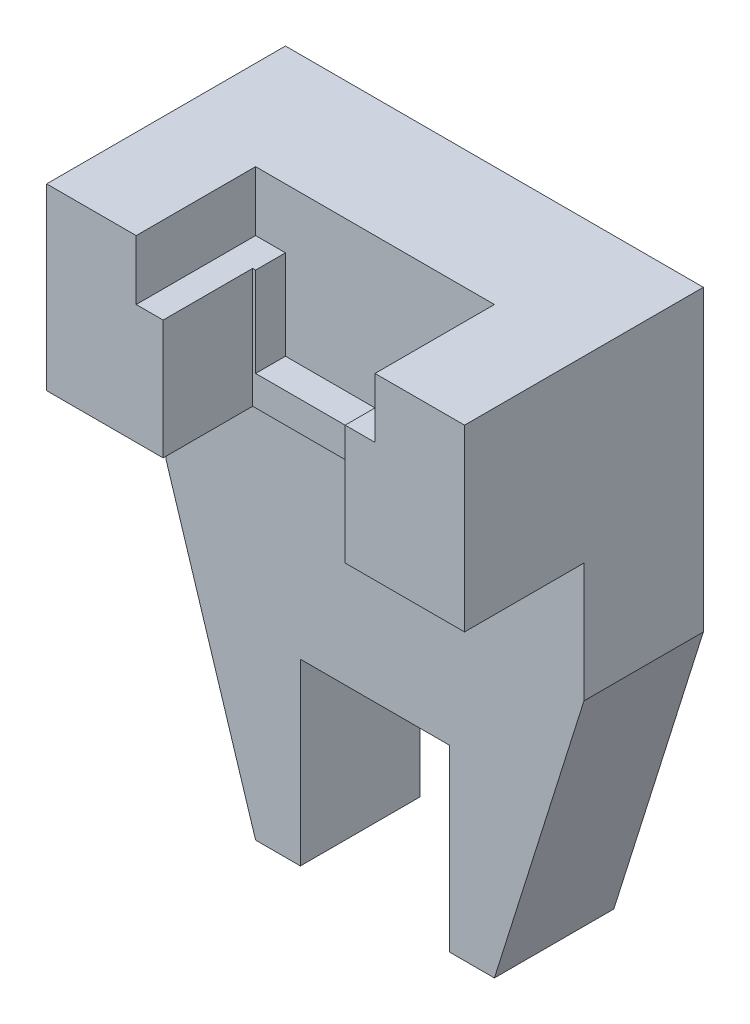
ISO-10303-21;
HEADER;
FILE_DESCRIPTION(('STEP AP214'),'2;1');
FILE_NAME('part.step','',(''),(''),'','','');
FILE_SCHEMA(('AUTOMOTIVE_DESIGN { 1 0 10303 214 1 1 1 1 }'));
ENDSEC;
DATA;
#1=APPLICATION_CONTEXT('core data for automotive mechanical design processes');
#2=APPLICATION_PROTOCOL_DEFINITION('international standard','automotive_design',2000,#1);
#3=PRODUCT_CONTEXT('',#1,'mechanical');
#4=PRODUCT('Part','Part','',(#3));
#5=PRODUCT_RELATED_PRODUCT_CATEGORY('part','',(#4));
#6=PRODUCT_DEFINITION_FORMATION('','',#4);
#7=PRODUCT_DEFINITION_CONTEXT('part definition',#1,'design');
#8=PRODUCT_DEFINITION('design','',#6,#7);
#9=PRODUCT_DEFINITION_SHAPE('','',#8);
#10=(LENGTH_UNIT() NAMED_UNIT(*) SI_UNIT(.MILLI.,.METRE.));
#11=(NAMED_UNIT(*) PLANE_ANGLE_UNIT() SI_UNIT($,.RADIAN.));
#12=(NAMED_UNIT(*) SI_UNIT($,.STERADIAN.) SOLID_ANGLE_UNIT());
#13=UNCERTAINTY_MEASURE_WITH_UNIT(LENGTH_MEASURE(1.E-05),#10,'distance_accuracy_value','');
#14=(GEOMETRIC_REPRESENTATION_CONTEXT(3) GLOBAL_UNCERTAINTY_ASSIGNED_CONTEXT((#13)) GLOBAL_UNIT_ASSIGNED_CONTEXT((#10,
#11,#12)) REPRESENTATION_CONTEXT('',''));
#15=CARTESIAN_POINT('',(0.,0.,0.));
#16=DIRECTION('',(0.,0.,1.));
#17=DIRECTION('',(1.,0.,0.));
#18=AXIS2_PLACEMENT_3D('',#15,#16,#17);
#19=CARTESIAN_POINT('',(0.,0.,40.));
#20=DIRECTION('',(0.,0.,-1.));
#21=DIRECTION('',(-1.,0.,0.));
#22=AXIS2_PLACEMENT_3D('',#19,#20,#21);
#23=PLANE('',#22);
#24=DIRECTION('',(1.,0.,0.));
#25=VECTOR('',#24,1.);
#26=CARTESIAN_POINT('',(-21.3380081003214,-30.,40.));
#27=LINE('',#26,#25);
#28=CARTESIAN_POINT('',(-21.3380081003214,-30.,40.));
#29=VERTEX_POINT('',#28);
#30=CARTESIAN_POINT('',(-1.82780526901638,-30.,40.));
#31=VERTEX_POINT('',#30);
#32=EDGE_CURVE('E241',#29,#31,#27,.T.);
#33=ORIENTED_EDGE('',*,*,#32,.T.);
#34=DIRECTION('',(0.,-1.,0.));
#35=VECTOR('',#34,1.);
#36=CARTESIAN_POINT('',(-1.82780526901638,10.,40.));
#37=LINE('',#36,#35);
#38=CARTESIAN_POINT('',(-1.82780526901638,-10.,40.));
#39=VERTEX_POINT('',#38);
#40=EDGE_CURVE('E230',#39,#31,#37,.T.);
#41=ORIENTED_EDGE('',*,*,#40,.F.);
#42=DIRECTION('',(-1.,0.,0.));
#43=VECTOR('',#42,1.);
#44=CARTESIAN_POINT('',(-21.3380081003214,-10.,40.));
#45=LINE('',#44,#43);
#46=CARTESIAN_POINT('',(-6.3380081003214,-10.,40.));
#47=VERTEX_POINT('',#46);
#48=EDGE_CURVE('E239',#39,#47,#45,.T.);
#49=ORIENTED_EDGE('',*,*,#48,.T.);
#50=DIRECTION('',(0.,1.,0.));
#51=VECTOR('',#50,1.);
#52=CARTESIAN_POINT('',(-6.3380081003214,-10.,40.));
#53=LINE('',#52,#51);
#54=CARTESIAN_POINT('',(-6.3380081003214,0.,40.));
#55=VERTEX_POINT('',#54);
#56=EDGE_CURVE('E279',#47,#55,#53,.T.);
#57=ORIENTED_EDGE('',*,*,#56,.T.);
#58=DIRECTION('',(-1.,0.,0.));
#59=VECTOR('',#58,1.);
#60=CARTESIAN_POINT('',(-6.3380081003214,0.,40.));
#61=LINE('',#60,#59);
#62=CARTESIAN_POINT('',(-21.3380081003214,0.,40.));
#63=VERTEX_POINT('',#62);
#64=EDGE_CURVE('E283',#55,#63,#61,.T.);
#65=ORIENTED_EDGE('',*,*,#64,.T.);
#66=DIRECTION('',(0.,-1.,0.));
#67=VECTOR('',#66,1.);
#68=CARTESIAN_POINT('',(-21.3380081003214,0.,40.));
#69=LINE('',#68,#67);
#70=EDGE_CURVE('E281',#63,#29,#69,.T.);
#71=ORIENTED_EDGE('',*,*,#70,.T.);
#72=EDGE_LOOP('',(#33,#41,#49,#57,#65,#71));
#73=FACE_BOUND('',#72,.T.);
#74=ADVANCED_FACE('F37',(#73),#23,.F.);
#75=CARTESIAN_POINT('',(0.,0.,20.));
#76=DIRECTION('',(0.,0.,-1.));
#77=DIRECTION('',(-1.,0.,0.));
#78=AXIS2_PLACEMENT_3D('',#75,#76,#77);
#79=PLANE('',#78);
#80=DIRECTION('',(-1.,0.,0.));
#81=VECTOR('',#80,1.);
#82=CARTESIAN_POINT('',(0.,-10.,20.));
#83=LINE('',#82,#81);
#84=CARTESIAN_POINT('',(33.6619918996786,-10.,20.));
#85=VERTEX_POINT('',#84);
#86=CARTESIAN_POINT('',(28.6619918996786,-10.,20.));
#87=VERTEX_POINT('',#86);
#88=EDGE_CURVE('E259',#85,#87,#83,.T.);
#89=ORIENTED_EDGE('',*,*,#88,.F.);
#90=DIRECTION('',(0.,-1.,0.));
#91=VECTOR('',#90,1.);
#92=CARTESIAN_POINT('',(33.6619918996786,0.,20.));
#93=LINE('',#92,#91);
#94=CARTESIAN_POINT('',(33.6619918996786,0.,20.));
#95=VERTEX_POINT('',#94);
#96=EDGE_CURVE('E60',#95,#85,#93,.T.);
#97=ORIENTED_EDGE('',*,*,#96,.F.);
#98=DIRECTION('',(-1.,0.,0.));
#99=VECTOR('',#98,1.);
#100=CARTESIAN_POINT('',(48.6619918996786,0.,20.));
#101=LINE('',#100,#99);
#102=CARTESIAN_POINT('',(-6.3380081003214,0.,20.));
#103=VERTEX_POINT('',#102);
#104=EDGE_CURVE('E321',#95,#103,#101,.T.);
#105=ORIENTED_EDGE('',*,*,#104,.T.);
#106=DIRECTION('',(0.,1.,0.));
#107=VECTOR('',#106,1.);
#108=CARTESIAN_POINT('',(-6.3380081003214,0.,20.));
#109=LINE('',#108,#107);
#110=CARTESIAN_POINT('',(-6.3380081003214,-10.,20.));
#111=VERTEX_POINT('',#110);
#112=EDGE_CURVE('E286',#111,#103,#109,.T.);
#113=ORIENTED_EDGE('',*,*,#112,.F.);
#114=DIRECTION('',(-1.,0.,0.));
#115=VECTOR('',#114,1.);
#116=CARTESIAN_POINT('',(0.,-10.,20.));
#117=LINE('',#116,#115);
#118=CARTESIAN_POINT('',(-1.33800810032738,-10.,20.));
#119=VERTEX_POINT('',#118);
#120=EDGE_CURVE('E257',#119,#111,#117,.T.);
#121=ORIENTED_EDGE('',*,*,#120,.F.);
#122=DIRECTION('',(-3.98546270166459E-13,1.,0.));
#123=VECTOR('',#122,1.);
#124=CARTESIAN_POINT('',(-1.33800810033136,-5.33258137839574E-13,20.));
#125=LINE('',#124,#123);
#126=CARTESIAN_POINT('',(-1.3380081003214,-24.9991545416278,20.));
#127=VERTEX_POINT('',#126);
#128=EDGE_CURVE('E264',#127,#119,#125,.T.);
#129=ORIENTED_EDGE('',*,*,#128,.F.);
#130=DIRECTION('',(-1.,0.,0.));
#131=VECTOR('',#130,1.);
#132=CARTESIAN_POINT('',(0.,-24.9991545416278,20.));
#133=LINE('',#132,#131);
#134=CARTESIAN_POINT('',(28.6619918996786,-24.9991545416278,20.));
#135=VERTEX_POINT('',#134);
#136=EDGE_CURVE('E267',#135,#127,#133,.T.);
#137=ORIENTED_EDGE('',*,*,#136,.F.);
#138=DIRECTION('',(0.,-1.,0.));
#139=VECTOR('',#138,1.);
#140=CARTESIAN_POINT('',(28.6619918996786,0.,20.));
#141=LINE('',#140,#139);
#142=EDGE_CURVE('E270',#87,#135,#141,.T.);
#143=ORIENTED_EDGE('',*,*,#142,.F.);
#144=EDGE_LOOP('',(#89,#97,#105,#113,#121,#129,#137,#143));
#145=FACE_BOUND('',#144,.T.);
#146=ADVANCED_FACE('F456',(#145),#79,.F.);
#147=DIRECTION('',(1.,0.,0.));
#148=VECTOR('',#147,1.);
#149=CARTESIAN_POINT('',(0.,-30.,20.));
#150=LINE('',#149,#148);
#151=CARTESIAN_POINT('',(-21.3380081003214,-30.,20.));
#152=VERTEX_POINT('',#151);
#153=CARTESIAN_POINT('',(48.6619918996786,-30.,20.));
#154=VERTEX_POINT('',#153);
#155=EDGE_CURVE('E262',#152,#154,#150,.T.);
#156=ORIENTED_EDGE('',*,*,#155,.F.);
#157=DIRECTION('',(0.,-1.,0.));
#158=VECTOR('',#157,1.);
#159=CARTESIAN_POINT('',(-21.3380081003214,0.,20.));
#160=LINE('',#159,#158);
#161=CARTESIAN_POINT('',(-21.3380081003214,-50.,20.));
#162=VERTEX_POINT('',#161);
#163=EDGE_CURVE('E323',#152,#162,#160,.T.);
#164=ORIENTED_EDGE('',*,*,#163,.T.);
#165=DIRECTION('',(0.3,-0.953939201416946,0.));
#166=VECTOR('',#165,1.);
#167=CARTESIAN_POINT('',(-21.3380081003214,-50.,20.));
#168=LINE('',#167,#166);
#169=CARTESIAN_POINT('',(-6.33800810032138,-97.6969600708473,20.));
#170=VERTEX_POINT('',#169);
#171=EDGE_CURVE('E325',#162,#170,#168,.T.);
#172=ORIENTED_EDGE('',*,*,#171,.T.);
#173=DIRECTION('',(1.,0.,0.));
#174=VECTOR('',#173,1.);
#175=CARTESIAN_POINT('',(-6.33800810032138,-97.6969600708473,20.));
#176=LINE('',#175,#174);
#177=CARTESIAN_POINT('',(1.16199189967861,-97.6969600708473,20.));
#178=VERTEX_POINT('',#177);
#179=EDGE_CURVE('E327',#170,#178,#176,.T.);
#180=ORIENTED_EDGE('',*,*,#179,.T.);
#181=DIRECTION('',(0.,1.,0.));
#182=VECTOR('',#181,1.);
#183=CARTESIAN_POINT('',(1.16199189967861,-97.6969600708473,20.));
#184=LINE('',#183,#182);
#185=CARTESIAN_POINT('',(1.16199189967861,-67.6969600708473,20.));
#186=VERTEX_POINT('',#185);
#187=EDGE_CURVE('E304',#178,#186,#184,.T.);
#188=ORIENTED_EDGE('',*,*,#187,.T.);
#189=DIRECTION('',(1.,0.,0.));
#190=VECTOR('',#189,1.);
#191=CARTESIAN_POINT('',(1.16199189967861,-67.6969600708473,20.));
#192=LINE('',#191,#190);
#193=CARTESIAN_POINT('',(26.1619918996786,-67.6969600708473,20.));
#194=VERTEX_POINT('',#193);
#195=EDGE_CURVE('E307',#186,#194,#192,.T.);
#196=ORIENTED_EDGE('',*,*,#195,.T.);
#197=DIRECTION('',(0.,1.,0.));
#198=VECTOR('',#197,1.);
#199=CARTESIAN_POINT('',(26.1619918996786,-97.6969600708473,20.));
#200=LINE('',#199,#198);
#201=CARTESIAN_POINT('',(26.1619918996786,-97.6969600708473,20.));
#202=VERTEX_POINT('',#201);
#203=EDGE_CURVE('E310',#202,#194,#200,.T.);
#204=ORIENTED_EDGE('',*,*,#203,.F.);
#205=DIRECTION('',(-1.,0.,0.));
#206=VECTOR('',#205,1.);
#207=CARTESIAN_POINT('',(33.6619918996786,-97.6969600708473,20.));
#208=LINE('',#207,#206);
#209=CARTESIAN_POINT('',(33.6619918996786,-97.6969600708473,20.));
#210=VERTEX_POINT('',#209);
#211=EDGE_CURVE('E313',#210,#202,#208,.T.);
#212=ORIENTED_EDGE('',*,*,#211,.F.);
#213=DIRECTION('',(-0.3,-0.953939201416946,0.));
#214=VECTOR('',#213,1.);
#215=CARTESIAN_POINT('',(48.6619918996786,-50.,20.));
#216=LINE('',#215,#214);
#217=CARTESIAN_POINT('',(48.6619918996786,-50.,20.));
#218=VERTEX_POINT('',#217);
#219=EDGE_CURVE('E316',#218,#210,#216,.T.);
#220=ORIENTED_EDGE('',*,*,#219,.F.);
#221=DIRECTION('',(0.,-1.,0.));
#222=VECTOR('',#221,1.);
#223=CARTESIAN_POINT('',(48.6619918996786,0.,20.));
#224=LINE('',#223,#222);
#225=EDGE_CURVE('E319',#154,#218,#224,.T.);
#226=ORIENTED_EDGE('',*,*,#225,.F.);
#227=EDGE_LOOP('',(#156,#164,#172,#180,#188,#196,#204,#212,#220,#226));
#228=FACE_BOUND('',#227,.T.);
#229=ADVANCED_FACE('F397',(#228),#79,.F.);
#230=CARTESIAN_POINT('',(1.16199189967861,-97.6969600708473,20.));
#231=DIRECTION('',(-1.,0.,0.));
#232=DIRECTION('',(0.,-1.,0.));
#233=AXIS2_PLACEMENT_3D('',#230,#231,#232);
#234=PLANE('',#233);
#235=DIRECTION('',(0.,1.,0.));
#236=VECTOR('',#235,1.);
#237=CARTESIAN_POINT('',(1.16199189967861,-97.6969600708473,0.));
#238=LINE('',#237,#236);
#239=CARTESIAN_POINT('',(1.16199189967861,-97.6969600708473,0.));
#240=VERTEX_POINT('',#239);
#241=CARTESIAN_POINT('',(1.16199189967861,-67.6969600708473,0.));
#242=VERTEX_POINT('',#241);
#243=EDGE_CURVE('E303',#240,#242,#238,.T.);
#244=ORIENTED_EDGE('',*,*,#243,.T.);
#245=DIRECTION('',(0.,0.,-1.));
#246=VECTOR('',#245,1.);
#247=CARTESIAN_POINT('',(1.16199189967861,-67.6969600708473,20.));
#248=LINE('',#247,#246);
#249=EDGE_CURVE('E375',#186,#242,#248,.T.);
#250=ORIENTED_EDGE('',*,*,#249,.F.);
#251=ORIENTED_EDGE('',*,*,#187,.F.);
#252=DIRECTION('',(0.,0.,-1.));
#253=VECTOR('',#252,1.);
#254=CARTESIAN_POINT('',(1.16199189967861,-97.6969600708473,20.));
#255=LINE('',#254,#253);
#256=EDGE_CURVE('E329',#178,#240,#255,.T.);
#257=ORIENTED_EDGE('',*,*,#256,.T.);
#258=EDGE_LOOP('',(#244,#250,#251,#257));
#259=FACE_BOUND('',#258,.T.);
#260=ADVANCED_FACE('F39',(#259),#234,.F.);
#261=CARTESIAN_POINT('',(1.16199189967861,-67.6969600708473,20.));
#262=DIRECTION('',(0.,1.,0.));
#263=DIRECTION('',(0.,0.,1.));
#264=AXIS2_PLACEMENT_3D('',#261,#262,#263);
#265=PLANE('',#264);
#266=DIRECTION('',(1.,0.,0.));
#267=VECTOR('',#266,1.);
#268=CARTESIAN_POINT('',(1.16199189967861,-67.6969600708473,0.));
#269=LINE('',#268,#267);
#270=CARTESIAN_POINT('',(26.1619918996786,-67.6969600708473,0.));
#271=VERTEX_POINT('',#270);
#272=EDGE_CURVE('E332',#242,#271,#269,.T.);
#273=ORIENTED_EDGE('',*,*,#272,.T.);
#274=DIRECTION('',(0.,0.,-1.));
#275=VECTOR('',#274,1.);
#276=CARTESIAN_POINT('',(26.1619918996786,-67.6969600708473,20.));
#277=LINE('',#276,#275);
#278=EDGE_CURVE('E373',#194,#271,#277,.T.);
#279=ORIENTED_EDGE('',*,*,#278,.F.);
#280=ORIENTED_EDGE('',*,*,#195,.F.);
#281=ORIENTED_EDGE('',*,*,#249,.T.);
#282=EDGE_LOOP('',(#273,#279,#280,#281));
#283=FACE_BOUND('',#282,.T.);
#284=ADVANCED_FACE('F417',(#283),#265,.F.);
#285=CARTESIAN_POINT('',(26.1619918996786,-97.6969600708473,20.));
#286=DIRECTION('',(-1.,0.,0.));
#287=DIRECTION('',(0.,-1.,0.));
#288=AXIS2_PLACEMENT_3D('',#285,#286,#287);
#289=PLANE('',#288);
#290=DIRECTION('',(0.,1.,0.));
#291=VECTOR('',#290,1.);
#292=CARTESIAN_POINT('',(26.1619918996786,-97.6969600708473,0.));
#293=LINE('',#292,#291);
#294=CARTESIAN_POINT('',(26.1619918996786,-97.6969600708473,0.));
#295=VERTEX_POINT('',#294);
#296=EDGE_CURVE('E335',#295,#271,#293,.T.);
#297=ORIENTED_EDGE('',*,*,#296,.F.);
#298=DIRECTION('',(0.,0.,-1.));
#299=VECTOR('',#298,1.);
#300=CARTESIAN_POINT('',(26.1619918996786,-97.6969600708473,20.));
#301=LINE('',#300,#299);
#302=EDGE_CURVE('E371',#202,#295,#301,.T.);
#303=ORIENTED_EDGE('',*,*,#302,.F.);
#304=ORIENTED_EDGE('',*,*,#203,.T.);
#305=ORIENTED_EDGE('',*,*,#278,.T.);
#306=EDGE_LOOP('',(#297,#303,#304,#305));
#307=FACE_BOUND('',#306,.T.);
#308=ADVANCED_FACE('F466',(#307),#289,.T.);
#309=CARTESIAN_POINT('',(33.6619918996786,-97.6969600708473,20.));
#310=DIRECTION('',(0.,-1.,0.));
#311=DIRECTION('',(0.,0.,-1.));
#312=AXIS2_PLACEMENT_3D('',#309,#310,#311);
#313=PLANE('',#312);
#314=DIRECTION('',(-1.,0.,0.));
#315=VECTOR('',#314,1.);
#316=CARTESIAN_POINT('',(33.6619918996786,-97.6969600708473,0.));
#317=LINE('',#316,#315);
#318=CARTESIAN_POINT('',(33.6619918996786,-97.6969600708473,0.));
#319=VERTEX_POINT('',#318);
#320=EDGE_CURVE('E338',#319,#295,#317,.T.);
#321=ORIENTED_EDGE('',*,*,#320,.F.);
#322=DIRECTION('',(0.,0.,-1.));
#323=VECTOR('',#322,1.);
#324=CARTESIAN_POINT('',(33.6619918996786,-97.6969600708473,20.));
#325=LINE('',#324,#323);
#326=EDGE_CURVE('E369',#210,#319,#325,.T.);
#327=ORIENTED_EDGE('',*,*,#326,.F.);
#328=ORIENTED_EDGE('',*,*,#211,.T.);
#329=ORIENTED_EDGE('',*,*,#302,.T.);
#330=EDGE_LOOP('',(#321,#327,#328,#329));
#331=FACE_BOUND('',#330,.T.);
#332=ADVANCED_FACE('F424',(#331),#313,.T.);
#333=CARTESIAN_POINT('',(48.6619918996786,-50.,20.));
#334=DIRECTION('',(0.953939201416946,-0.3,0.));
#335=DIRECTION('',(0.3,0.953939201416946,0.));
#336=AXIS2_PLACEMENT_3D('',#333,#334,#335);
#337=PLANE('',#336);
#338=DIRECTION('',(-0.3,-0.953939201416946,0.));
#339=VECTOR('',#338,1.);
#340=CARTESIAN_POINT('',(48.6619918996786,-50.,0.));
#341=LINE('',#340,#339);
#342=CARTESIAN_POINT('',(48.6619918996786,-50.,0.));
#343=VERTEX_POINT('',#342);
#344=EDGE_CURVE('E341',#343,#319,#341,.T.);
#345=ORIENTED_EDGE('',*,*,#344,.F.);
#346=DIRECTION('',(0.,0.,-1.));
#347=VECTOR('',#346,1.);
#348=CARTESIAN_POINT('',(48.6619918996786,-50.,20.));
#349=LINE('',#348,#347);
#350=EDGE_CURVE('E366',#218,#343,#349,.T.);
#351=ORIENTED_EDGE('',*,*,#350,.F.);
#352=ORIENTED_EDGE('',*,*,#219,.T.);
#353=ORIENTED_EDGE('',*,*,#326,.T.);
#354=EDGE_LOOP('',(#345,#351,#352,#353));
#355=FACE_BOUND('',#354,.T.);
#356=ADVANCED_FACE('F428',(#355),#337,.T.);
#357=CARTESIAN_POINT('',(48.6619918996786,0.,20.));
#358=DIRECTION('',(1.,0.,0.));
#359=DIRECTION('',(0.,1.,0.));
#360=AXIS2_PLACEMENT_3D('',#357,#358,#359);
#361=PLANE('',#360);
#362=DIRECTION('',(0.,0.,-1.));
#363=VECTOR('',#362,1.);
#364=CARTESIAN_POINT('',(48.6619918996786,-30.,40.));
#365=LINE('',#364,#363);
#366=CARTESIAN_POINT('',(48.6619918996786,-30.,40.));
#367=VERTEX_POINT('',#366);
#368=EDGE_CURVE('E244',#367,#154,#365,.T.);
#369=ORIENTED_EDGE('',*,*,#368,.T.);
#370=ORIENTED_EDGE('',*,*,#225,.T.);
#371=ORIENTED_EDGE('',*,*,#350,.T.);
#372=DIRECTION('',(0.,-1.,0.));
#373=VECTOR('',#372,1.);
#374=CARTESIAN_POINT('',(48.6619918996786,0.,0.));
#375=LINE('',#374,#373);
#376=CARTESIAN_POINT('',(48.6619918996786,0.,0.));
#377=VERTEX_POINT('',#376);
#378=EDGE_CURVE('E344',#377,#343,#375,.T.);
#379=ORIENTED_EDGE('',*,*,#378,.F.);
#380=DIRECTION('',(0.,0.,-1.));
#381=VECTOR('',#380,1.);
#382=CARTESIAN_POINT('',(48.6619918996786,0.,20.));
#383=LINE('',#382,#381);
#384=CARTESIAN_POINT('',(48.6619918996786,0.,40.));
#385=VERTEX_POINT('',#384);
#386=EDGE_CURVE('E364',#385,#377,#383,.T.);
#387=ORIENTED_EDGE('',*,*,#386,.F.);
#388=DIRECTION('',(0.,1.,0.));
#389=VECTOR('',#388,1.);
#390=CARTESIAN_POINT('',(48.6619918996786,0.,40.));
#391=LINE('',#390,#389);
#392=EDGE_CURVE('E289',#367,#385,#391,.T.);
#393=ORIENTED_EDGE('',*,*,#392,.F.);
#394=EDGE_LOOP('',(#369,#370,#371,#379,#387,#393));
#395=FACE_BOUND('',#394,.T.);
#396=ADVANCED_FACE('F432',(#395),#361,.T.);
#397=CARTESIAN_POINT('',(48.6619918996786,0.,20.));
#398=DIRECTION('',(0.,-1.,0.));
#399=DIRECTION('',(0.,0.,-1.));
#400=AXIS2_PLACEMENT_3D('',#397,#398,#399);
#401=PLANE('',#400);
#402=DIRECTION('',(0.,0.,-1.));
#403=VECTOR('',#402,1.);
#404=CARTESIAN_POINT('',(-21.3380081003214,0.,20.));
#405=LINE('',#404,#403);
#406=CARTESIAN_POINT('',(-21.3380081003214,0.,0.));
#407=VERTEX_POINT('',#406);
#408=EDGE_CURVE('E361',#63,#407,#405,.T.);
#409=ORIENTED_EDGE('',*,*,#408,.F.);
#410=ORIENTED_EDGE('',*,*,#64,.F.);
#411=DIRECTION('',(0.,0.,-1.));
#412=VECTOR('',#411,1.);
#413=CARTESIAN_POINT('',(-6.3380081003214,0.,40.));
#414=LINE('',#413,#412);
#415=EDGE_CURVE('E276',#55,#103,#414,.T.);
#416=ORIENTED_EDGE('',*,*,#415,.T.);
#417=ORIENTED_EDGE('',*,*,#104,.F.);
#418=DIRECTION('',(0.,0.,-1.));
#419=VECTOR('',#418,1.);
#420=CARTESIAN_POINT('',(33.6619918996786,0.,40.));
#421=LINE('',#420,#419);
#422=CARTESIAN_POINT('',(33.6619918996786,0.,40.));
#423=VERTEX_POINT('',#422);
#424=EDGE_CURVE('E299',#423,#95,#421,.T.);
#425=ORIENTED_EDGE('',*,*,#424,.F.);
#426=DIRECTION('',(-1.,0.,0.));
#427=VECTOR('',#426,1.);
#428=CARTESIAN_POINT('',(48.6619918996786,0.,40.));
#429=LINE('',#428,#427);
#430=EDGE_CURVE('E292',#385,#423,#429,.T.);
#431=ORIENTED_EDGE('',*,*,#430,.F.);
#432=ORIENTED_EDGE('',*,*,#386,.T.);
#433=DIRECTION('',(-1.,0.,0.));
#434=VECTOR('',#433,1.);
#435=CARTESIAN_POINT('',(48.6619918996786,0.,0.));
#436=LINE('',#435,#434);
#437=EDGE_CURVE('E346',#377,#407,#436,.T.);
#438=ORIENTED_EDGE('',*,*,#437,.T.);
#439=EDGE_LOOP('',(#409,#410,#416,#417,#425,#431,#432,#438));
#440=FACE_BOUND('',#439,.T.);
#441=ADVANCED_FACE('F462',(#440),#401,.F.);
#442=CARTESIAN_POINT('',(-21.3380081003214,0.,20.));
#443=DIRECTION('',(1.,0.,0.));
#444=DIRECTION('',(0.,1.,0.));
#445=AXIS2_PLACEMENT_3D('',#442,#443,#444);
#446=PLANE('',#445);
#447=ORIENTED_EDGE('',*,*,#163,.F.);
#448=DIRECTION('',(0.,0.,-1.));
#449=VECTOR('',#448,1.);
#450=CARTESIAN_POINT('',(-21.3380081003214,-30.,40.));
#451=LINE('',#450,#449);
#452=EDGE_CURVE('E247',#29,#152,#451,.T.);
#453=ORIENTED_EDGE('',*,*,#452,.F.);
#454=ORIENTED_EDGE('',*,*,#70,.F.);
#455=ORIENTED_EDGE('',*,*,#408,.T.);
#456=DIRECTION('',(0.,-1.,0.));
#457=VECTOR('',#456,1.);
#458=CARTESIAN_POINT('',(-21.3380081003214,0.,0.));
#459=LINE('',#458,#457);
#460=CARTESIAN_POINT('',(-21.3380081003214,-50.,0.));
#461=VERTEX_POINT('',#460);
#462=EDGE_CURVE('E348',#407,#461,#459,.T.);
#463=ORIENTED_EDGE('',*,*,#462,.T.);
#464=DIRECTION('',(0.,0.,-1.));
#465=VECTOR('',#464,1.);
#466=CARTESIAN_POINT('',(-21.3380081003214,-50.,20.));
#467=LINE('',#466,#465);
#468=EDGE_CURVE('E358',#162,#461,#467,.T.);
#469=ORIENTED_EDGE('',*,*,#468,.F.);
#470=EDGE_LOOP('',(#447,#453,#454,#455,#463,#469));
#471=FACE_BOUND('',#470,.T.);
#472=ADVANCED_FACE('F400',(#471),#446,.F.);
#473=CARTESIAN_POINT('',(-21.3380081003214,-50.,20.));
#474=DIRECTION('',(0.953939201416946,0.3,0.));
#475=DIRECTION('',(-0.3,0.953939201416946,0.));
#476=AXIS2_PLACEMENT_3D('',#473,#474,#475);
#477=PLANE('',#476);
#478=DIRECTION('',(0.3,-0.953939201416946,0.));
#479=VECTOR('',#478,1.);
#480=CARTESIAN_POINT('',(-21.3380081003214,-50.,0.));
#481=LINE('',#480,#479);
#482=CARTESIAN_POINT('',(-6.33800810032138,-97.6969600708473,0.));
#483=VERTEX_POINT('',#482);
#484=EDGE_CURVE('E350',#461,#483,#481,.T.);
#485=ORIENTED_EDGE('',*,*,#484,.T.);
#486=DIRECTION('',(0.,0.,-1.));
#487=VECTOR('',#486,1.);
#488=CARTESIAN_POINT('',(-6.33800810032138,-97.6969600708473,20.));
#489=LINE('',#488,#487);
#490=EDGE_CURVE('E355',#170,#483,#489,.T.);
#491=ORIENTED_EDGE('',*,*,#490,.F.);
#492=ORIENTED_EDGE('',*,*,#171,.F.);
#493=ORIENTED_EDGE('',*,*,#468,.T.);
#494=EDGE_LOOP('',(#485,#491,#492,#493));
#495=FACE_BOUND('',#494,.T.);
#496=ADVANCED_FACE('F406',(#495),#477,.F.);
#497=CARTESIAN_POINT('',(-6.33800810032138,-97.6969600708473,20.));
#498=DIRECTION('',(0.,1.,0.));
#499=DIRECTION('',(0.,0.,1.));
#500=AXIS2_PLACEMENT_3D('',#497,#498,#499);
#501=PLANE('',#500);
#502=DIRECTION('',(1.,0.,0.));
#503=VECTOR('',#502,1.);
#504=CARTESIAN_POINT('',(-6.33800810032138,-97.6969600708473,0.));
#505=LINE('',#504,#503);
#506=EDGE_CURVE('E308',#483,#240,#505,.T.);
#507=ORIENTED_EDGE('',*,*,#506,.T.);
#508=ORIENTED_EDGE('',*,*,#256,.F.);
#509=ORIENTED_EDGE('',*,*,#179,.F.);
#510=ORIENTED_EDGE('',*,*,#490,.T.);
#511=EDGE_LOOP('',(#507,#508,#509,#510));
#512=FACE_BOUND('',#511,.T.);
#513=ADVANCED_FACE('F412',(#512),#501,.F.);
#514=CARTESIAN_POINT('',(0.,0.,0.));
#515=DIRECTION('',(0.,0.,-1.));
#516=DIRECTION('',(-1.,0.,0.));
#517=AXIS2_PLACEMENT_3D('',#514,#515,#516);
#518=PLANE('',#517);
#519=ORIENTED_EDGE('',*,*,#378,.T.);
#520=ORIENTED_EDGE('',*,*,#344,.T.);
#521=ORIENTED_EDGE('',*,*,#320,.T.);
#522=ORIENTED_EDGE('',*,*,#296,.T.);
#523=ORIENTED_EDGE('',*,*,#272,.F.);
#524=ORIENTED_EDGE('',*,*,#243,.F.);
#525=ORIENTED_EDGE('',*,*,#506,.F.);
#526=ORIENTED_EDGE('',*,*,#484,.F.);
#527=ORIENTED_EDGE('',*,*,#462,.F.);
#528=ORIENTED_EDGE('',*,*,#437,.F.);
#529=EDGE_LOOP('',(#519,#520,#521,#522,#523,#524,#525,#526,#527,#528));
#530=FACE_BOUND('',#529,.T.);
#531=ADVANCED_FACE('F465',(#530),#518,.T.);
#532=CARTESIAN_POINT('',(33.6619918996786,-10.,40.));
#533=DIRECTION('',(1.,0.,0.));
#534=DIRECTION('',(0.,0.,-1.));
#535=AXIS2_PLACEMENT_3D('',#532,#533,#534);
#536=PLANE('',#535);
#537=ORIENTED_EDGE('',*,*,#424,.T.);
#538=ORIENTED_EDGE('',*,*,#96,.T.);
#539=DIRECTION('',(0.,0.,-1.));
#540=VECTOR('',#539,1.);
#541=CARTESIAN_POINT('',(33.6619918996786,-10.,40.));
#542=LINE('',#541,#540);
#543=CARTESIAN_POINT('',(33.6619918996786,-10.,40.));
#544=VERTEX_POINT('',#543);
#545=EDGE_CURVE('E297',#544,#85,#542,.T.);
#546=ORIENTED_EDGE('',*,*,#545,.F.);
#547=DIRECTION('',(0.,-1.,0.));
#548=VECTOR('',#547,1.);
#549=CARTESIAN_POINT('',(33.6619918996786,-10.,40.));
#550=LINE('',#549,#548);
#551=EDGE_CURVE('E294',#423,#544,#550,.T.);
#552=ORIENTED_EDGE('',*,*,#551,.F.);
#553=EDGE_LOOP('',(#537,#538,#546,#552));
#554=FACE_BOUND('',#553,.T.);
#555=ADVANCED_FACE('F483',(#554),#536,.F.);
#556=DIRECTION('',(-1.,0.,0.));
#557=VECTOR('',#556,1.);
#558=CARTESIAN_POINT('',(28.6619918996786,-10.,40.));
#559=LINE('',#558,#557);
#560=CARTESIAN_POINT('',(28.6621947309836,-10.,40.));
#561=VERTEX_POINT('',#560);
#562=EDGE_CURVE('E236',#544,#561,#559,.T.);
#563=ORIENTED_EDGE('',*,*,#562,.T.);
#564=DIRECTION('',(0.,-1.,0.));
#565=VECTOR('',#564,1.);
#566=CARTESIAN_POINT('',(28.6621947309836,10.,40.));
#567=LINE('',#566,#565);
#568=CARTESIAN_POINT('',(28.6621947309836,-30.,40.));
#569=VERTEX_POINT('',#568);
#570=EDGE_CURVE('E215',#561,#569,#567,.T.);
#571=ORIENTED_EDGE('',*,*,#570,.T.);
#572=EDGE_CURVE('E220',#569,#367,#27,.T.);
#573=ORIENTED_EDGE('',*,*,#572,.T.);
#574=ORIENTED_EDGE('',*,*,#392,.T.);
#575=ORIENTED_EDGE('',*,*,#430,.T.);
#576=ORIENTED_EDGE('',*,*,#551,.T.);
#577=EDGE_LOOP('',(#563,#571,#573,#574,#575,#576));
#578=FACE_BOUND('',#577,.T.);
#579=ADVANCED_FACE('F436',(#578),#23,.F.);
#580=CARTESIAN_POINT('',(-6.3380081003214,-10.,40.));
#581=DIRECTION('',(-1.,0.,0.));
#582=DIRECTION('',(0.,-1.,0.));
#583=AXIS2_PLACEMENT_3D('',#580,#581,#582);
#584=PLANE('',#583);
#585=DIRECTION('',(0.,0.,-1.));
#586=VECTOR('',#585,1.);
#587=CARTESIAN_POINT('',(-6.3380081003214,-10.,40.));
#588=LINE('',#587,#586);
#589=EDGE_CURVE('E273',#47,#111,#588,.T.);
#590=ORIENTED_EDGE('',*,*,#589,.T.);
#591=ORIENTED_EDGE('',*,*,#112,.T.);
#592=ORIENTED_EDGE('',*,*,#415,.F.);
#593=ORIENTED_EDGE('',*,*,#56,.F.);
#594=EDGE_LOOP('',(#590,#591,#592,#593));
#595=FACE_BOUND('',#594,.T.);
#596=ADVANCED_FACE('F459',(#595),#584,.F.);
#597=CARTESIAN_POINT('',(28.6619918996786,-24.9991545416278,40.));
#598=DIRECTION('',(1.,0.,0.));
#599=DIRECTION('',(0.,0.,-1.));
#600=AXIS2_PLACEMENT_3D('',#597,#598,#599);
#601=PLANE('',#600);
#602=DIRECTION('',(0.,0.,-1.));
#603=VECTOR('',#602,1.);
#604=CARTESIAN_POINT('',(28.6619918996786,-24.9991545416278,40.));
#605=LINE('',#604,#603);
#606=CARTESIAN_POINT('',(28.6619918996786,-24.9991545416278,25.));
#607=VERTEX_POINT('',#606);
#608=EDGE_CURVE('E253',#607,#135,#605,.T.);
#609=ORIENTED_EDGE('',*,*,#608,.F.);
#610=DIRECTION('',(0.,1.,0.));
#611=VECTOR('',#610,1.);
#612=CARTESIAN_POINT('',(28.6619918996786,-24.9991545416278,25.));
#613=LINE('',#612,#611);
#614=CARTESIAN_POINT('',(28.6619918996786,-10.,25.));
#615=VERTEX_POINT('',#614);
#616=EDGE_CURVE('E226',#607,#615,#613,.T.);
#617=ORIENTED_EDGE('',*,*,#616,.T.);
#618=DIRECTION('',(0.,0.,-1.));
#619=VECTOR('',#618,1.);
#620=CARTESIAN_POINT('',(28.6619918996786,-10.,40.));
#621=LINE('',#620,#619);
#622=EDGE_CURVE('E255',#615,#87,#621,.T.);
#623=ORIENTED_EDGE('',*,*,#622,.T.);
#624=ORIENTED_EDGE('',*,*,#142,.T.);
#625=EDGE_LOOP('',(#609,#617,#623,#624));
#626=FACE_BOUND('',#625,.T.);
#627=ADVANCED_FACE('F444',(#626),#601,.F.);
#628=CARTESIAN_POINT('',(-1.3380081003214,-24.9991545416278,40.));
#629=DIRECTION('',(0.,-1.,0.));
#630=DIRECTION('',(0.,0.,-1.));
#631=AXIS2_PLACEMENT_3D('',#628,#629,#630);
#632=PLANE('',#631);
#633=DIRECTION('',(1.,0.,0.));
#634=VECTOR('',#633,1.);
#635=CARTESIAN_POINT('',(-1.3380081003214,-24.9991545416278,25.));
#636=LINE('',#635,#634);
#637=CARTESIAN_POINT('',(-1.3380081003214,-24.9991545416278,25.));
#638=VERTEX_POINT('',#637);
#639=EDGE_CURVE('E234',#638,#607,#636,.T.);
#640=ORIENTED_EDGE('',*,*,#639,.T.);
#641=ORIENTED_EDGE('',*,*,#608,.T.);
#642=ORIENTED_EDGE('',*,*,#136,.T.);
#643=DIRECTION('',(0.,0.,-1.));
#644=VECTOR('',#643,1.);
#645=CARTESIAN_POINT('',(-1.3380081003214,-24.9991545416278,40.));
#646=LINE('',#645,#644);
#647=EDGE_CURVE('E251',#638,#127,#646,.T.);
#648=ORIENTED_EDGE('',*,*,#647,.F.);
#649=EDGE_LOOP('',(#640,#641,#642,#648));
#650=FACE_BOUND('',#649,.T.);
#651=ADVANCED_FACE('F448',(#650),#632,.F.);
#652=CARTESIAN_POINT('',(-1.33800810032738,-10.,40.));
#653=DIRECTION('',(-1.,-3.98546270166459E-13,0.));
#654=DIRECTION('',(3.98546270166459E-13,-1.,0.));
#655=AXIS2_PLACEMENT_3D('',#652,#653,#654);
#656=PLANE('',#655);
#657=DIRECTION('',(0.,0.,-1.));
#658=VECTOR('',#657,1.);
#659=CARTESIAN_POINT('',(-1.33800810032738,-10.,40.));
#660=LINE('',#659,#658);
#661=CARTESIAN_POINT('',(-1.33800810032738,-10.,25.));
#662=VERTEX_POINT('',#661);
#663=EDGE_CURVE('E249',#662,#119,#660,.T.);
#664=ORIENTED_EDGE('',*,*,#663,.F.);
#665=DIRECTION('',(3.98546270166459E-13,-1.,0.));
#666=VECTOR('',#665,1.);
#667=CARTESIAN_POINT('',(-1.33800810032738,-10.,25.));
#668=LINE('',#667,#666);
#669=EDGE_CURVE('E52',#662,#638,#668,.T.);
#670=ORIENTED_EDGE('',*,*,#669,.T.);
#671=ORIENTED_EDGE('',*,*,#647,.T.);
#672=ORIENTED_EDGE('',*,*,#128,.T.);
#673=EDGE_LOOP('',(#664,#670,#671,#672));
#674=FACE_BOUND('',#673,.T.);
#675=ADVANCED_FACE('F452',(#674),#656,.F.);
#676=CARTESIAN_POINT('',(-21.3380081003214,-30.,40.));
#677=DIRECTION('',(0.,1.,0.));
#678=DIRECTION('',(-1.,0.,0.));
#679=AXIS2_PLACEMENT_3D('',#676,#677,#678);
#680=PLANE('',#679);
#681=ORIENTED_EDGE('',*,*,#572,.F.);
#682=DIRECTION('',(0.,0.,1.));
#683=VECTOR('',#682,1.);
#684=CARTESIAN_POINT('',(28.6621947309836,-30.,40.));
#685=LINE('',#684,#683);
#686=CARTESIAN_POINT('',(28.6621947309836,-30.,25.));
#687=VERTEX_POINT('',#686);
#688=EDGE_CURVE('E213',#687,#569,#685,.T.);
#689=ORIENTED_EDGE('',*,*,#688,.F.);
#690=DIRECTION('',(1.,0.,0.));
#691=VECTOR('',#690,1.);
#692=CARTESIAN_POINT('',(-1.82780526901638,-30.,25.));
#693=LINE('',#692,#691);
#694=CARTESIAN_POINT('',(-1.82780526901638,-30.,25.));
#695=VERTEX_POINT('',#694);
#696=EDGE_CURVE('E198',#695,#687,#693,.T.);
#697=ORIENTED_EDGE('',*,*,#696,.F.);
#698=DIRECTION('',(0.,0.,-1.));
#699=VECTOR('',#698,1.);
#700=CARTESIAN_POINT('',(-1.82780526901638,-30.,40.));
#701=LINE('',#700,#699);
#702=EDGE_CURVE('E209',#31,#695,#701,.T.);
#703=ORIENTED_EDGE('',*,*,#702,.F.);
#704=ORIENTED_EDGE('',*,*,#32,.F.);
#705=ORIENTED_EDGE('',*,*,#452,.T.);
#706=ORIENTED_EDGE('',*,*,#155,.T.);
#707=ORIENTED_EDGE('',*,*,#368,.F.);
#708=EDGE_LOOP('',(#681,#689,#697,#703,#704,#705,#706,#707));
#709=FACE_BOUND('',#708,.T.);
#710=ADVANCED_FACE('F218',(#709),#680,.F.);
#711=CARTESIAN_POINT('',(28.6619918996786,-10.,40.));
#712=DIRECTION('',(0.,-1.,0.));
#713=DIRECTION('',(0.,0.,-1.));
#714=AXIS2_PLACEMENT_3D('',#711,#712,#713);
#715=PLANE('',#714);
#716=DIRECTION('',(1.,0.,0.));
#717=VECTOR('',#716,1.);
#718=CARTESIAN_POINT('',(28.6619918996786,-10.,25.));
#719=LINE('',#718,#717);
#720=CARTESIAN_POINT('',(28.6621947309836,-10.,25.));
#721=VERTEX_POINT('',#720);
#722=EDGE_CURVE('E223',#615,#721,#719,.T.);
#723=ORIENTED_EDGE('',*,*,#722,.T.);
#724=DIRECTION('',(0.,0.,1.));
#725=VECTOR('',#724,1.);
#726=CARTESIAN_POINT('',(28.6621947309836,-10.,40.));
#727=LINE('',#726,#725);
#728=EDGE_CURVE('E11',#721,#561,#727,.T.);
#729=ORIENTED_EDGE('',*,*,#728,.T.);
#730=ORIENTED_EDGE('',*,*,#562,.F.);
#731=ORIENTED_EDGE('',*,*,#545,.T.);
#732=ORIENTED_EDGE('',*,*,#88,.T.);
#733=ORIENTED_EDGE('',*,*,#622,.F.);
#734=EDGE_LOOP('',(#723,#729,#730,#731,#732,#733));
#735=FACE_BOUND('',#734,.T.);
#736=ADVANCED_FACE('F439',(#735),#715,.F.);
#737=CARTESIAN_POINT('',(-21.3380081003214,-10.,40.));
#738=DIRECTION('',(0.,-1.,0.));
#739=DIRECTION('',(1.,0.,0.));
#740=AXIS2_PLACEMENT_3D('',#737,#738,#739);
#741=PLANE('',#740);
#742=ORIENTED_EDGE('',*,*,#48,.F.);
#743=DIRECTION('',(0.,0.,-1.));
#744=VECTOR('',#743,1.);
#745=CARTESIAN_POINT('',(-1.82780526901638,-10.,40.));
#746=LINE('',#745,#744);
#747=CARTESIAN_POINT('',(-1.82780526901638,-10.,25.));
#748=VERTEX_POINT('',#747);
#749=EDGE_CURVE('E45',#39,#748,#746,.T.);
#750=ORIENTED_EDGE('',*,*,#749,.T.);
#751=DIRECTION('',(1.,0.,0.));
#752=VECTOR('',#751,1.);
#753=CARTESIAN_POINT('',(-21.3380081003214,-10.,25.));
#754=LINE('',#753,#752);
#755=EDGE_CURVE('E378',#748,#662,#754,.T.);
#756=ORIENTED_EDGE('',*,*,#755,.T.);
#757=ORIENTED_EDGE('',*,*,#663,.T.);
#758=ORIENTED_EDGE('',*,*,#120,.T.);
#759=ORIENTED_EDGE('',*,*,#589,.F.);
#760=EDGE_LOOP('',(#742,#750,#756,#757,#758,#759));
#761=FACE_BOUND('',#760,.T.);
#762=ADVANCED_FACE('F382',(#761),#741,.F.);
#763=CARTESIAN_POINT('',(-1.82780526901638,10.,40.));
#764=DIRECTION('',(-1.,0.,0.));
#765=DIRECTION('',(0.,0.,1.));
#766=AXIS2_PLACEMENT_3D('',#763,#764,#765);
#767=PLANE('',#766);
#768=ORIENTED_EDGE('',*,*,#40,.T.);
#769=ORIENTED_EDGE('',*,*,#702,.T.);
#770=DIRECTION('',(0.,-1.,0.));
#771=VECTOR('',#770,1.);
#772=CARTESIAN_POINT('',(-1.82780526901638,10.,25.));
#773=LINE('',#772,#771);
#774=EDGE_CURVE('E204',#748,#695,#773,.T.);
#775=ORIENTED_EDGE('',*,*,#774,.F.);
#776=ORIENTED_EDGE('',*,*,#749,.F.);
#777=EDGE_LOOP('',(#768,#769,#775,#776));
#778=FACE_BOUND('',#777,.T.);
#779=ADVANCED_FACE('F387',(#778),#767,.F.);
#780=CARTESIAN_POINT('',(-1.82780526901638,10.,25.));
#781=DIRECTION('',(0.,0.,-1.));
#782=DIRECTION('',(-1.,0.,0.));
#783=AXIS2_PLACEMENT_3D('',#780,#781,#782);
#784=PLANE('',#783);
#785=ORIENTED_EDGE('',*,*,#669,.F.);
#786=ORIENTED_EDGE('',*,*,#755,.F.);
#787=ORIENTED_EDGE('',*,*,#774,.T.);
#788=ORIENTED_EDGE('',*,*,#696,.T.);
#789=DIRECTION('',(0.,-1.,0.));
#790=VECTOR('',#789,1.);
#791=CARTESIAN_POINT('',(28.6621947309836,10.,25.));
#792=LINE('',#791,#790);
#793=EDGE_CURVE('E201',#721,#687,#792,.T.);
#794=ORIENTED_EDGE('',*,*,#793,.F.);
#795=ORIENTED_EDGE('',*,*,#722,.F.);
#796=ORIENTED_EDGE('',*,*,#616,.F.);
#797=ORIENTED_EDGE('',*,*,#639,.F.);
#798=EDGE_LOOP('',(#785,#786,#787,#788,#794,#795,#796,#797));
#799=FACE_BOUND('',#798,.T.);
#800=ADVANCED_FACE('F200',(#799),#784,.F.);
#801=CARTESIAN_POINT('',(28.6621947309836,10.,40.));
#802=DIRECTION('',(1.,0.,0.));
#803=DIRECTION('',(0.,1.,0.));
#804=AXIS2_PLACEMENT_3D('',#801,#802,#803);
#805=PLANE('',#804);
#806=ORIENTED_EDGE('',*,*,#793,.T.);
#807=ORIENTED_EDGE('',*,*,#688,.T.);
#808=ORIENTED_EDGE('',*,*,#570,.F.);
#809=ORIENTED_EDGE('',*,*,#728,.F.);
#810=EDGE_LOOP('',(#806,#807,#808,#809));
#811=FACE_BOUND('',#810,.T.);
#812=ADVANCED_FACE('F212',(#811),#805,.F.);
#813=CLOSED_SHELL('',(#74,#146,#229,#260,#284,#308,#332,#356,#396,#441,#472,#496,#513,#531,#555,
#579,#596,#627,#651,#675,#710,#736,#762,#779,#800,#812));
#814=MANIFOLD_SOLID_BREP('B2',#813);
#815=ADVANCED_BREP_SHAPE_REPRESENTATION('',(#18,#814),#14);
#816=SHAPE_DEFINITION_REPRESENTATION(#9,#815);
ENDSEC;
END-ISO-10303-21;
